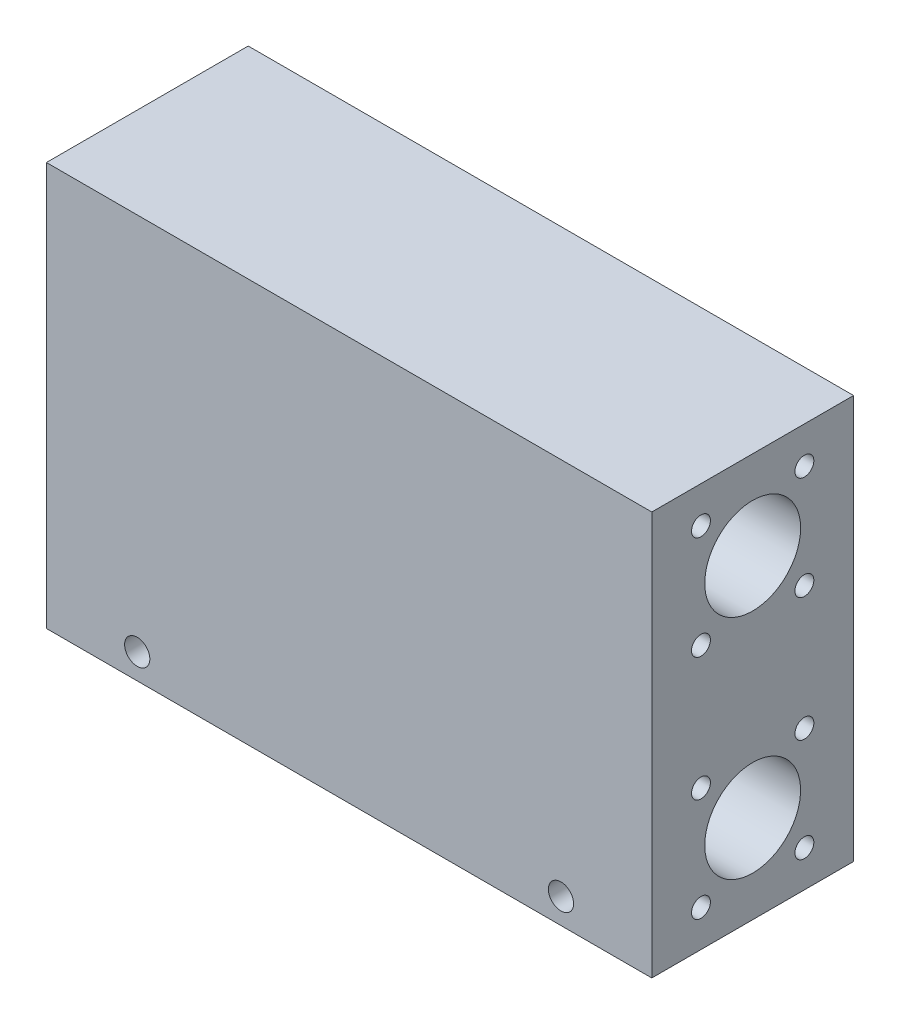
ISO-10303-21;
HEADER;
FILE_DESCRIPTION(('STEP AP214'),'2;1');
FILE_NAME('part.step','',(''),(''),'','','');
FILE_SCHEMA(('AUTOMOTIVE_DESIGN { 1 0 10303 214 1 1 1 1 }'));
ENDSEC;
DATA;
#1=APPLICATION_CONTEXT('core data for automotive mechanical design processes');
#2=APPLICATION_PROTOCOL_DEFINITION('international standard','automotive_design',2000,#1);
#3=PRODUCT_CONTEXT('',#1,'mechanical');
#4=PRODUCT('Part','Part','',(#3));
#5=PRODUCT_RELATED_PRODUCT_CATEGORY('part','',(#4));
#6=PRODUCT_DEFINITION_FORMATION('','',#4);
#7=PRODUCT_DEFINITION_CONTEXT('part definition',#1,'design');
#8=PRODUCT_DEFINITION('design','',#6,#7);
#9=PRODUCT_DEFINITION_SHAPE('','',#8);
#10=(LENGTH_UNIT() NAMED_UNIT(*) SI_UNIT(.MILLI.,.METRE.));
#11=(NAMED_UNIT(*) PLANE_ANGLE_UNIT() SI_UNIT($,.RADIAN.));
#12=(NAMED_UNIT(*) SI_UNIT($,.STERADIAN.) SOLID_ANGLE_UNIT());
#13=UNCERTAINTY_MEASURE_WITH_UNIT(LENGTH_MEASURE(1.E-05),#10,'distance_accuracy_value','');
#14=(GEOMETRIC_REPRESENTATION_CONTEXT(3) GLOBAL_UNCERTAINTY_ASSIGNED_CONTEXT((#13)) GLOBAL_UNIT_ASSIGNED_CONTEXT((#10,
#11,#12)) REPRESENTATION_CONTEXT('',''));
#15=CARTESIAN_POINT('',(0.,0.,0.));
#16=DIRECTION('',(0.,0.,1.));
#17=DIRECTION('',(1.,0.,0.));
#18=AXIS2_PLACEMENT_3D('',#15,#16,#17);
#19=CARTESIAN_POINT('',(0.,0.,40.));
#20=DIRECTION('',(-1.,0.,0.));
#21=DIRECTION('',(0.,0.,1.));
#22=AXIS2_PLACEMENT_3D('',#19,#20,#21);
#23=PLANE('',#22);
#24=CARTESIAN_POINT('',(0.,62.5,20.));
#25=DIRECTION('',(-1.,0.,0.));
#26=DIRECTION('',(0.,0.,1.));
#27=AXIS2_PLACEMENT_3D('',#24,#25,#26);
#28=CIRCLE('',#27,9.5);
#29=CARTESIAN_POINT('',(0.,62.5,29.5));
#30=VERTEX_POINT('',#29);
#31=EDGE_CURVE('E201',#30,#30,#28,.T.);
#32=ORIENTED_EDGE('',*,*,#31,.F.);
#33=EDGE_LOOP('',(#32));
#34=FACE_BOUND('',#33,.T.);
#35=CARTESIAN_POINT('',(0.,17.5,20.));
#36=DIRECTION('',(-1.,0.,0.));
#37=DIRECTION('',(0.,0.,-1.));
#38=AXIS2_PLACEMENT_3D('',#35,#36,#37);
#39=CIRCLE('',#38,9.5);
#40=CARTESIAN_POINT('',(0.,17.5,10.5));
#41=VERTEX_POINT('',#40);
#42=EDGE_CURVE('E204',#41,#41,#39,.T.);
#43=ORIENTED_EDGE('',*,*,#42,.F.);
#44=EDGE_LOOP('',(#43));
#45=FACE_BOUND('',#44,.T.);
#46=CARTESIAN_POINT('',(0.,27.75,9.74999999999998));
#47=DIRECTION('',(-1.,0.,0.));
#48=DIRECTION('',(0.,0.,-1.));
#49=AXIS2_PLACEMENT_3D('',#46,#47,#48);
#50=CIRCLE('',#49,1.85);
#51=CARTESIAN_POINT('',(0.,27.75,7.89999999999998));
#52=VERTEX_POINT('',#51);
#53=EDGE_CURVE('E234',#52,#52,#50,.T.);
#54=ORIENTED_EDGE('',*,*,#53,.F.);
#55=EDGE_LOOP('',(#54));
#56=FACE_BOUND('',#55,.T.);
#57=CARTESIAN_POINT('',(0.,52.25,9.74999999999998));
#58=DIRECTION('',(-1.,0.,0.));
#59=DIRECTION('',(0.,0.,1.));
#60=AXIS2_PLACEMENT_3D('',#57,#58,#59);
#61=CIRCLE('',#60,1.85);
#62=CARTESIAN_POINT('',(0.,52.25,11.6));
#63=VERTEX_POINT('',#62);
#64=EDGE_CURVE('E227',#63,#63,#61,.T.);
#65=ORIENTED_EDGE('',*,*,#64,.F.);
#66=EDGE_LOOP('',(#65));
#67=FACE_BOUND('',#66,.T.);
#68=CARTESIAN_POINT('',(0.,52.25,30.25));
#69=DIRECTION('',(-1.,0.,0.));
#70=DIRECTION('',(0.,0.,-1.));
#71=AXIS2_PLACEMENT_3D('',#68,#69,#70);
#72=CIRCLE('',#71,1.85);
#73=CARTESIAN_POINT('',(0.,52.25,28.4));
#74=VERTEX_POINT('',#73);
#75=EDGE_CURVE('E246',#74,#74,#72,.T.);
#76=ORIENTED_EDGE('',*,*,#75,.F.);
#77=EDGE_LOOP('',(#76));
#78=FACE_BOUND('',#77,.T.);
#79=CARTESIAN_POINT('',(0.,72.75,9.74999999999998));
#80=DIRECTION('',(-1.,0.,0.));
#81=DIRECTION('',(0.,0.,-1.));
#82=AXIS2_PLACEMENT_3D('',#79,#80,#81);
#83=CIRCLE('',#82,1.85);
#84=CARTESIAN_POINT('',(0.,72.75,7.89999999999998));
#85=VERTEX_POINT('',#84);
#86=EDGE_CURVE('E239',#85,#85,#83,.T.);
#87=ORIENTED_EDGE('',*,*,#86,.F.);
#88=EDGE_LOOP('',(#87));
#89=FACE_BOUND('',#88,.T.);
#90=CARTESIAN_POINT('',(0.,27.75,30.25));
#91=DIRECTION('',(-1.,0.,0.));
#92=DIRECTION('',(0.,0.,1.));
#93=AXIS2_PLACEMENT_3D('',#90,#91,#92);
#94=CIRCLE('',#93,1.85);
#95=CARTESIAN_POINT('',(0.,27.75,32.1));
#96=VERTEX_POINT('',#95);
#97=EDGE_CURVE('E209',#96,#96,#94,.T.);
#98=ORIENTED_EDGE('',*,*,#97,.F.);
#99=EDGE_LOOP('',(#98));
#100=FACE_BOUND('',#99,.T.);
#101=CARTESIAN_POINT('',(0.,7.25000000000001,30.25));
#102=DIRECTION('',(-1.,0.,0.));
#103=DIRECTION('',(0.,0.,-1.));
#104=AXIS2_PLACEMENT_3D('',#101,#102,#103);
#105=CIRCLE('',#104,1.85);
#106=CARTESIAN_POINT('',(0.,7.25000000000001,28.4));
#107=VERTEX_POINT('',#106);
#108=EDGE_CURVE('E216',#107,#107,#105,.T.);
#109=ORIENTED_EDGE('',*,*,#108,.F.);
#110=EDGE_LOOP('',(#109));
#111=FACE_BOUND('',#110,.T.);
#112=CARTESIAN_POINT('',(0.,7.25000000000001,9.74999999999998));
#113=DIRECTION('',(-1.,0.,0.));
#114=DIRECTION('',(0.,0.,1.));
#115=AXIS2_PLACEMENT_3D('',#112,#113,#114);
#116=CIRCLE('',#115,1.85);
#117=CARTESIAN_POINT('',(0.,7.25000000000001,11.6));
#118=VERTEX_POINT('',#117);
#119=EDGE_CURVE('E222',#118,#118,#116,.T.);
#120=ORIENTED_EDGE('',*,*,#119,.F.);
#121=EDGE_LOOP('',(#120));
#122=FACE_BOUND('',#121,.T.);
#123=CARTESIAN_POINT('',(0.,72.75,30.25));
#124=DIRECTION('',(-1.,0.,0.));
#125=DIRECTION('',(0.,0.,1.));
#126=AXIS2_PLACEMENT_3D('',#123,#124,#125);
#127=CIRCLE('',#126,1.85);
#128=CARTESIAN_POINT('',(0.,72.75,32.1));
#129=VERTEX_POINT('',#128);
#130=EDGE_CURVE('E242',#129,#129,#127,.T.);
#131=ORIENTED_EDGE('',*,*,#130,.F.);
#132=EDGE_LOOP('',(#131));
#133=FACE_BOUND('',#132,.T.);
#134=DIRECTION('',(0.,1.,0.));
#135=VECTOR('',#134,1.);
#136=CARTESIAN_POINT('',(0.,0.,0.));
#137=LINE('',#136,#135);
#138=CARTESIAN_POINT('',(0.,0.,0.));
#139=VERTEX_POINT('',#138);
#140=CARTESIAN_POINT('',(0.,80.,0.));
#141=VERTEX_POINT('',#140);
#142=EDGE_CURVE('E109',#139,#141,#137,.T.);
#143=ORIENTED_EDGE('',*,*,#142,.F.);
#144=DIRECTION('',(0.,0.,-1.));
#145=VECTOR('',#144,1.);
#146=CARTESIAN_POINT('',(0.,0.,40.));
#147=LINE('',#146,#145);
#148=CARTESIAN_POINT('',(0.,0.,40.));
#149=VERTEX_POINT('',#148);
#150=EDGE_CURVE('E11',#149,#139,#147,.T.);
#151=ORIENTED_EDGE('',*,*,#150,.F.);
#152=DIRECTION('',(0.,1.,0.));
#153=VECTOR('',#152,1.);
#154=CARTESIAN_POINT('',(0.,0.,40.));
#155=LINE('',#154,#153);
#156=CARTESIAN_POINT('',(0.,80.,40.));
#157=VERTEX_POINT('',#156);
#158=EDGE_CURVE('E103',#149,#157,#155,.T.);
#159=ORIENTED_EDGE('',*,*,#158,.T.);
#160=DIRECTION('',(0.,0.,-1.));
#161=VECTOR('',#160,1.);
#162=CARTESIAN_POINT('',(0.,80.,40.));
#163=LINE('',#162,#161);
#164=EDGE_CURVE('E82',#157,#141,#163,.T.);
#165=ORIENTED_EDGE('',*,*,#164,.T.);
#166=EDGE_LOOP('',(#143,#151,#159,#165));
#167=FACE_BOUND('',#166,.T.);
#168=ADVANCED_FACE('F41',(#34,#45,#56,#67,#78,#89,#100,#111,#122,#133,#167),#23,.T.);
#169=CARTESIAN_POINT('',(0.,0.,40.));
#170=DIRECTION('',(0.,1.,0.));
#171=DIRECTION('',(0.,0.,1.));
#172=AXIS2_PLACEMENT_3D('',#169,#170,#171);
#173=PLANE('',#172);
#174=DIRECTION('',(1.,0.,0.));
#175=VECTOR('',#174,1.);
#176=CARTESIAN_POINT('',(0.,0.,0.));
#177=LINE('',#176,#175);
#178=CARTESIAN_POINT('',(120.,0.,0.));
#179=VERTEX_POINT('',#178);
#180=EDGE_CURVE('E74',#139,#179,#177,.T.);
#181=ORIENTED_EDGE('',*,*,#180,.T.);
#182=DIRECTION('',(0.,0.,-1.));
#183=VECTOR('',#182,1.);
#184=CARTESIAN_POINT('',(120.,0.,40.));
#185=LINE('',#184,#183);
#186=CARTESIAN_POINT('',(120.,0.,40.));
#187=VERTEX_POINT('',#186);
#188=EDGE_CURVE('E50',#187,#179,#185,.T.);
#189=ORIENTED_EDGE('',*,*,#188,.F.);
#190=DIRECTION('',(1.,0.,0.));
#191=VECTOR('',#190,1.);
#192=CARTESIAN_POINT('',(0.,0.,40.));
#193=LINE('',#192,#191);
#194=EDGE_CURVE('E92',#149,#187,#193,.T.);
#195=ORIENTED_EDGE('',*,*,#194,.F.);
#196=ORIENTED_EDGE('',*,*,#150,.T.);
#197=EDGE_LOOP('',(#181,#189,#195,#196));
#198=FACE_BOUND('',#197,.T.);
#199=ADVANCED_FACE('F258',(#198),#173,.F.);
#200=CARTESIAN_POINT('',(120.,0.,40.));
#201=DIRECTION('',(-1.,0.,0.));
#202=DIRECTION('',(0.,0.,1.));
#203=AXIS2_PLACEMENT_3D('',#200,#201,#202);
#204=PLANE('',#203);
#205=CARTESIAN_POINT('',(120.,62.5,20.));
#206=DIRECTION('',(1.,0.,0.));
#207=DIRECTION('',(0.,0.,-1.));
#208=AXIS2_PLACEMENT_3D('',#205,#206,#207);
#209=CIRCLE('',#208,9.5);
#210=CARTESIAN_POINT('',(120.,62.5,10.5));
#211=VERTEX_POINT('',#210);
#212=EDGE_CURVE('E141',#211,#211,#209,.T.);
#213=ORIENTED_EDGE('',*,*,#212,.F.);
#214=EDGE_LOOP('',(#213));
#215=FACE_BOUND('',#214,.T.);
#216=CARTESIAN_POINT('',(120.,17.5,20.));
#217=DIRECTION('',(1.,0.,0.));
#218=DIRECTION('',(0.,0.,1.));
#219=AXIS2_PLACEMENT_3D('',#216,#217,#218);
#220=CIRCLE('',#219,9.5);
#221=CARTESIAN_POINT('',(120.,17.5,29.5));
#222=VERTEX_POINT('',#221);
#223=EDGE_CURVE('E144',#222,#222,#220,.T.);
#224=ORIENTED_EDGE('',*,*,#223,.F.);
#225=EDGE_LOOP('',(#224));
#226=FACE_BOUND('',#225,.T.);
#227=CARTESIAN_POINT('',(120.,27.75,30.25));
#228=DIRECTION('',(1.,0.,0.));
#229=DIRECTION('',(0.,0.,1.));
#230=AXIS2_PLACEMENT_3D('',#227,#228,#229);
#231=CIRCLE('',#230,1.875);
#232=CARTESIAN_POINT('',(120.,27.75,32.125));
#233=VERTEX_POINT('',#232);
#234=EDGE_CURVE('E174',#233,#233,#231,.T.);
#235=ORIENTED_EDGE('',*,*,#234,.F.);
#236=EDGE_LOOP('',(#235));
#237=FACE_BOUND('',#236,.T.);
#238=CARTESIAN_POINT('',(120.,52.25,30.25));
#239=DIRECTION('',(1.,0.,0.));
#240=DIRECTION('',(0.,0.,-1.));
#241=AXIS2_PLACEMENT_3D('',#238,#239,#240);
#242=CIRCLE('',#241,1.875);
#243=CARTESIAN_POINT('',(120.,52.25,28.375));
#244=VERTEX_POINT('',#243);
#245=EDGE_CURVE('E167',#244,#244,#242,.T.);
#246=ORIENTED_EDGE('',*,*,#245,.F.);
#247=EDGE_LOOP('',(#246));
#248=FACE_BOUND('',#247,.T.);
#249=CARTESIAN_POINT('',(120.,52.25,9.75));
#250=DIRECTION('',(1.,0.,0.));
#251=DIRECTION('',(0.,0.,1.));
#252=AXIS2_PLACEMENT_3D('',#249,#250,#251);
#253=CIRCLE('',#252,1.875);
#254=CARTESIAN_POINT('',(120.,52.25,11.625));
#255=VERTEX_POINT('',#254);
#256=EDGE_CURVE('E186',#255,#255,#253,.T.);
#257=ORIENTED_EDGE('',*,*,#256,.F.);
#258=EDGE_LOOP('',(#257));
#259=FACE_BOUND('',#258,.T.);
#260=CARTESIAN_POINT('',(120.,72.75,30.25));
#261=DIRECTION('',(1.,0.,0.));
#262=DIRECTION('',(0.,0.,1.));
#263=AXIS2_PLACEMENT_3D('',#260,#261,#262);
#264=CIRCLE('',#263,1.875);
#265=CARTESIAN_POINT('',(120.,72.75,32.125));
#266=VERTEX_POINT('',#265);
#267=EDGE_CURVE('E179',#266,#266,#264,.T.);
#268=ORIENTED_EDGE('',*,*,#267,.F.);
#269=EDGE_LOOP('',(#268));
#270=FACE_BOUND('',#269,.T.);
#271=CARTESIAN_POINT('',(120.,27.75,9.75));
#272=DIRECTION('',(1.,0.,0.));
#273=DIRECTION('',(0.,0.,-1.));
#274=AXIS2_PLACEMENT_3D('',#271,#272,#273);
#275=CIRCLE('',#274,1.875);
#276=CARTESIAN_POINT('',(120.,27.75,7.875));
#277=VERTEX_POINT('',#276);
#278=EDGE_CURVE('E149',#277,#277,#275,.T.);
#279=ORIENTED_EDGE('',*,*,#278,.F.);
#280=EDGE_LOOP('',(#279));
#281=FACE_BOUND('',#280,.T.);
#282=CARTESIAN_POINT('',(120.,7.25000000000001,9.75));
#283=DIRECTION('',(1.,0.,0.));
#284=DIRECTION('',(0.,0.,1.));
#285=AXIS2_PLACEMENT_3D('',#282,#283,#284);
#286=CIRCLE('',#285,1.875);
#287=CARTESIAN_POINT('',(120.,7.25000000000001,11.625));
#288=VERTEX_POINT('',#287);
#289=EDGE_CURVE('E156',#288,#288,#286,.T.);
#290=ORIENTED_EDGE('',*,*,#289,.F.);
#291=EDGE_LOOP('',(#290));
#292=FACE_BOUND('',#291,.T.);
#293=CARTESIAN_POINT('',(120.,7.25000000000001,30.25));
#294=DIRECTION('',(1.,0.,0.));
#295=DIRECTION('',(0.,0.,-1.));
#296=AXIS2_PLACEMENT_3D('',#293,#294,#295);
#297=CIRCLE('',#296,1.875);
#298=CARTESIAN_POINT('',(120.,7.25000000000001,28.375));
#299=VERTEX_POINT('',#298);
#300=EDGE_CURVE('E162',#299,#299,#297,.T.);
#301=ORIENTED_EDGE('',*,*,#300,.F.);
#302=EDGE_LOOP('',(#301));
#303=FACE_BOUND('',#302,.T.);
#304=CARTESIAN_POINT('',(120.,72.75,9.75));
#305=DIRECTION('',(1.,0.,0.));
#306=DIRECTION('',(0.,0.,-1.));
#307=AXIS2_PLACEMENT_3D('',#304,#305,#306);
#308=CIRCLE('',#307,1.875);
#309=CARTESIAN_POINT('',(120.,72.75,7.875));
#310=VERTEX_POINT('',#309);
#311=EDGE_CURVE('E182',#310,#310,#308,.T.);
#312=ORIENTED_EDGE('',*,*,#311,.F.);
#313=EDGE_LOOP('',(#312));
#314=FACE_BOUND('',#313,.T.);
#315=DIRECTION('',(0.,1.,0.));
#316=VECTOR('',#315,1.);
#317=CARTESIAN_POINT('',(120.,0.,0.));
#318=LINE('',#317,#316);
#319=CARTESIAN_POINT('',(120.,80.,0.));
#320=VERTEX_POINT('',#319);
#321=EDGE_CURVE('E99',#179,#320,#318,.T.);
#322=ORIENTED_EDGE('',*,*,#321,.T.);
#323=DIRECTION('',(0.,0.,-1.));
#324=VECTOR('',#323,1.);
#325=CARTESIAN_POINT('',(120.,80.,40.));
#326=LINE('',#325,#324);
#327=CARTESIAN_POINT('',(120.,80.,40.));
#328=VERTEX_POINT('',#327);
#329=EDGE_CURVE('E96',#328,#320,#326,.T.);
#330=ORIENTED_EDGE('',*,*,#329,.F.);
#331=DIRECTION('',(0.,1.,0.));
#332=VECTOR('',#331,1.);
#333=CARTESIAN_POINT('',(120.,0.,40.));
#334=LINE('',#333,#332);
#335=EDGE_CURVE('E87',#187,#328,#334,.T.);
#336=ORIENTED_EDGE('',*,*,#335,.F.);
#337=ORIENTED_EDGE('',*,*,#188,.T.);
#338=EDGE_LOOP('',(#322,#330,#336,#337));
#339=FACE_BOUND('',#338,.T.);
#340=ADVANCED_FACE('F97',(#215,#226,#237,#248,#259,#270,#281,#292,#303,#314,#339),#204,.F.);
#341=CARTESIAN_POINT('',(0.,80.,40.));
#342=DIRECTION('',(0.,1.,0.));
#343=DIRECTION('',(0.,0.,1.));
#344=AXIS2_PLACEMENT_3D('',#341,#342,#343);
#345=PLANE('',#344);
#346=DIRECTION('',(1.,0.,0.));
#347=VECTOR('',#346,1.);
#348=CARTESIAN_POINT('',(0.,80.,0.));
#349=LINE('',#348,#347);
#350=EDGE_CURVE('E112',#141,#320,#349,.T.);
#351=ORIENTED_EDGE('',*,*,#350,.F.);
#352=ORIENTED_EDGE('',*,*,#164,.F.);
#353=DIRECTION('',(1.,0.,0.));
#354=VECTOR('',#353,1.);
#355=CARTESIAN_POINT('',(0.,80.,40.));
#356=LINE('',#355,#354);
#357=EDGE_CURVE('E91',#157,#328,#356,.T.);
#358=ORIENTED_EDGE('',*,*,#357,.T.);
#359=ORIENTED_EDGE('',*,*,#329,.T.);
#360=EDGE_LOOP('',(#351,#352,#358,#359));
#361=FACE_BOUND('',#360,.T.);
#362=ADVANCED_FACE('F102',(#361),#345,.T.);
#363=CARTESIAN_POINT('',(0.,0.,40.));
#364=DIRECTION('',(0.,0.,-1.));
#365=DIRECTION('',(-1.,0.,0.));
#366=AXIS2_PLACEMENT_3D('',#363,#364,#365);
#367=PLANE('',#366);
#368=CARTESIAN_POINT('',(102.,5.,40.));
#369=DIRECTION('',(0.,0.,-1.));
#370=DIRECTION('',(-1.,0.,0.));
#371=AXIS2_PLACEMENT_3D('',#368,#369,#370);
#372=CIRCLE('',#371,2.49999999999999);
#373=CARTESIAN_POINT('',(99.5,5.,40.));
#374=VERTEX_POINT('',#373);
#375=EDGE_CURVE('E131',#374,#374,#372,.T.);
#376=ORIENTED_EDGE('',*,*,#375,.T.);
#377=EDGE_LOOP('',(#376));
#378=FACE_BOUND('',#377,.T.);
#379=CARTESIAN_POINT('',(18.,5.,40.));
#380=DIRECTION('',(0.,0.,-1.));
#381=DIRECTION('',(-1.,0.,0.));
#382=AXIS2_PLACEMENT_3D('',#379,#380,#381);
#383=CIRCLE('',#382,2.5);
#384=CARTESIAN_POINT('',(15.5,5.,40.));
#385=VERTEX_POINT('',#384);
#386=EDGE_CURVE('E134',#385,#385,#383,.T.);
#387=ORIENTED_EDGE('',*,*,#386,.T.);
#388=EDGE_LOOP('',(#387));
#389=FACE_BOUND('',#388,.T.);
#390=ORIENTED_EDGE('',*,*,#158,.F.);
#391=ORIENTED_EDGE('',*,*,#194,.T.);
#392=ORIENTED_EDGE('',*,*,#335,.T.);
#393=ORIENTED_EDGE('',*,*,#357,.F.);
#394=EDGE_LOOP('',(#390,#391,#392,#393));
#395=FACE_BOUND('',#394,.T.);
#396=ADVANCED_FACE('F90',(#378,#389,#395),#367,.F.);
#397=CARTESIAN_POINT('',(0.,0.,0.));
#398=DIRECTION('',(0.,0.,-1.));
#399=DIRECTION('',(-1.,0.,0.));
#400=AXIS2_PLACEMENT_3D('',#397,#398,#399);
#401=PLANE('',#400);
#402=CARTESIAN_POINT('',(102.,5.,0.));
#403=DIRECTION('',(0.,0.,-1.));
#404=DIRECTION('',(-1.,0.,0.));
#405=AXIS2_PLACEMENT_3D('',#402,#403,#404);
#406=CIRCLE('',#405,2.49999999999999);
#407=CARTESIAN_POINT('',(99.5,5.,0.));
#408=VERTEX_POINT('',#407);
#409=EDGE_CURVE('E936',#408,#408,#406,.T.);
#410=ORIENTED_EDGE('',*,*,#409,.F.);
#411=EDGE_LOOP('',(#410));
#412=FACE_BOUND('',#411,.T.);
#413=CARTESIAN_POINT('',(18.,5.,0.));
#414=DIRECTION('',(0.,0.,-1.));
#415=DIRECTION('',(-1.,0.,0.));
#416=AXIS2_PLACEMENT_3D('',#413,#414,#415);
#417=CIRCLE('',#416,2.5);
#418=CARTESIAN_POINT('',(15.5,5.,0.));
#419=VERTEX_POINT('',#418);
#420=EDGE_CURVE('E937',#419,#419,#417,.T.);
#421=ORIENTED_EDGE('',*,*,#420,.F.);
#422=EDGE_LOOP('',(#421));
#423=FACE_BOUND('',#422,.T.);
#424=ORIENTED_EDGE('',*,*,#142,.T.);
#425=ORIENTED_EDGE('',*,*,#350,.T.);
#426=ORIENTED_EDGE('',*,*,#321,.F.);
#427=ORIENTED_EDGE('',*,*,#180,.F.);
#428=EDGE_LOOP('',(#424,#425,#426,#427));
#429=FACE_BOUND('',#428,.T.);
#430=ADVANCED_FACE('F261',(#412,#423,#429),#401,.T.);
#431=CARTESIAN_POINT('',(14.,72.75,30.25));
#432=DIRECTION('',(-1.,0.,0.));
#433=DIRECTION('',(0.,0.,1.));
#434=AXIS2_PLACEMENT_3D('',#431,#432,#433);
#435=CYLINDRICAL_SURFACE('',#434,1.85);
#436=CARTESIAN_POINT('',(14.,72.75,30.25));
#437=DIRECTION('',(-1.,0.,0.));
#438=DIRECTION('',(0.,0.,1.));
#439=AXIS2_PLACEMENT_3D('',#436,#437,#438);
#440=CIRCLE('',#439,1.85);
#441=CARTESIAN_POINT('',(14.,72.75,32.1));
#442=VERTEX_POINT('',#441);
#443=EDGE_CURVE('E113',#442,#442,#440,.T.);
#444=ORIENTED_EDGE('',*,*,#443,.F.);
#445=EDGE_LOOP('',(#444));
#446=FACE_BOUND('',#445,.T.);
#447=ORIENTED_EDGE('',*,*,#130,.T.);
#448=EDGE_LOOP('',(#447));
#449=FACE_BOUND('',#448,.T.);
#450=ADVANCED_FACE('F255',(#446,#449),#435,.F.);
#451=CARTESIAN_POINT('',(14.,72.75,30.25));
#452=DIRECTION('',(-1.,0.,0.));
#453=DIRECTION('',(0.,0.,1.));
#454=AXIS2_PLACEMENT_3D('',#451,#452,#453);
#455=PLANE('',#454);
#456=ORIENTED_EDGE('',*,*,#443,.T.);
#457=EDGE_LOOP('',(#456));
#458=FACE_BOUND('',#457,.T.);
#459=ADVANCED_FACE('F269',(#458),#455,.T.);
#460=CARTESIAN_POINT('',(14.,7.25000000000001,9.74999999999998));
#461=DIRECTION('',(-1.,0.,0.));
#462=DIRECTION('',(0.,0.,1.));
#463=AXIS2_PLACEMENT_3D('',#460,#461,#462);
#464=CYLINDRICAL_SURFACE('',#463,1.85);
#465=CARTESIAN_POINT('',(14.,7.25000000000001,9.74999999999998));
#466=DIRECTION('',(-1.,0.,0.));
#467=DIRECTION('',(0.,0.,1.));
#468=AXIS2_PLACEMENT_3D('',#465,#466,#467);
#469=CIRCLE('',#468,1.85);
#470=CARTESIAN_POINT('',(14.,7.25000000000001,11.6));
#471=VERTEX_POINT('',#470);
#472=EDGE_CURVE('E200',#471,#471,#469,.T.);
#473=ORIENTED_EDGE('',*,*,#472,.F.);
#474=EDGE_LOOP('',(#473));
#475=FACE_BOUND('',#474,.T.);
#476=ORIENTED_EDGE('',*,*,#119,.T.);
#477=EDGE_LOOP('',(#476));
#478=FACE_BOUND('',#477,.T.);
#479=ADVANCED_FACE('F713',(#475,#478),#464,.F.);
#480=CARTESIAN_POINT('',(14.,7.25000000000001,9.74999999999998));
#481=DIRECTION('',(-1.,0.,0.));
#482=DIRECTION('',(0.,0.,1.));
#483=AXIS2_PLACEMENT_3D('',#480,#481,#482);
#484=PLANE('',#483);
#485=ORIENTED_EDGE('',*,*,#472,.T.);
#486=EDGE_LOOP('',(#485));
#487=FACE_BOUND('',#486,.T.);
#488=ADVANCED_FACE('F703',(#487),#484,.T.);
#489=CARTESIAN_POINT('',(14.,7.25000000000001,30.25));
#490=DIRECTION('',(-1.,0.,0.));
#491=DIRECTION('',(0.,0.,1.));
#492=AXIS2_PLACEMENT_3D('',#489,#490,#491);
#493=CYLINDRICAL_SURFACE('',#492,1.85);
#494=CARTESIAN_POINT('',(14.,7.25000000000001,30.25));
#495=DIRECTION('',(-1.,0.,0.));
#496=DIRECTION('',(0.,0.,-1.));
#497=AXIS2_PLACEMENT_3D('',#494,#495,#496);
#498=CIRCLE('',#497,1.85);
#499=CARTESIAN_POINT('',(14.,7.25000000000001,28.4));
#500=VERTEX_POINT('',#499);
#501=EDGE_CURVE('E219',#500,#500,#498,.T.);
#502=ORIENTED_EDGE('',*,*,#501,.F.);
#503=EDGE_LOOP('',(#502));
#504=FACE_BOUND('',#503,.T.);
#505=ORIENTED_EDGE('',*,*,#108,.T.);
#506=EDGE_LOOP('',(#505));
#507=FACE_BOUND('',#506,.T.);
#508=ADVANCED_FACE('F693',(#504,#507),#493,.F.);
#509=CARTESIAN_POINT('',(14.,7.25000000000001,30.25));
#510=DIRECTION('',(1.,0.,0.));
#511=DIRECTION('',(0.,0.,-1.));
#512=AXIS2_PLACEMENT_3D('',#509,#510,#511);
#513=PLANE('',#512);
#514=ORIENTED_EDGE('',*,*,#501,.T.);
#515=EDGE_LOOP('',(#514));
#516=FACE_BOUND('',#515,.T.);
#517=ADVANCED_FACE('F683',(#516),#513,.F.);
#518=CARTESIAN_POINT('',(14.,27.75,30.25));
#519=DIRECTION('',(-1.,0.,0.));
#520=DIRECTION('',(0.,0.,1.));
#521=AXIS2_PLACEMENT_3D('',#518,#519,#520);
#522=CYLINDRICAL_SURFACE('',#521,1.85);
#523=CARTESIAN_POINT('',(14.,27.75,30.25));
#524=DIRECTION('',(-1.,0.,0.));
#525=DIRECTION('',(0.,0.,1.));
#526=AXIS2_PLACEMENT_3D('',#523,#524,#525);
#527=CIRCLE('',#526,1.85);
#528=CARTESIAN_POINT('',(14.,27.75,32.1));
#529=VERTEX_POINT('',#528);
#530=EDGE_CURVE('E213',#529,#529,#527,.T.);
#531=ORIENTED_EDGE('',*,*,#530,.F.);
#532=EDGE_LOOP('',(#531));
#533=FACE_BOUND('',#532,.T.);
#534=ORIENTED_EDGE('',*,*,#97,.T.);
#535=EDGE_LOOP('',(#534));
#536=FACE_BOUND('',#535,.T.);
#537=ADVANCED_FACE('F673',(#533,#536),#522,.F.);
#538=CARTESIAN_POINT('',(14.,27.75,30.25));
#539=DIRECTION('',(-1.,0.,0.));
#540=DIRECTION('',(0.,0.,1.));
#541=AXIS2_PLACEMENT_3D('',#538,#539,#540);
#542=PLANE('',#541);
#543=ORIENTED_EDGE('',*,*,#530,.T.);
#544=EDGE_LOOP('',(#543));
#545=FACE_BOUND('',#544,.T.);
#546=ADVANCED_FACE('F663',(#545),#542,.T.);
#547=CARTESIAN_POINT('',(14.,72.75,9.74999999999998));
#548=DIRECTION('',(-1.,0.,0.));
#549=DIRECTION('',(0.,0.,1.));
#550=AXIS2_PLACEMENT_3D('',#547,#548,#549);
#551=CYLINDRICAL_SURFACE('',#550,1.85);
#552=CARTESIAN_POINT('',(14.,72.75,9.74999999999998));
#553=DIRECTION('',(-1.,0.,0.));
#554=DIRECTION('',(0.,0.,-1.));
#555=AXIS2_PLACEMENT_3D('',#552,#553,#554);
#556=CIRCLE('',#555,1.85);
#557=CARTESIAN_POINT('',(14.,72.75,7.89999999999998));
#558=VERTEX_POINT('',#557);
#559=EDGE_CURVE('E243',#558,#558,#556,.T.);
#560=ORIENTED_EDGE('',*,*,#559,.F.);
#561=EDGE_LOOP('',(#560));
#562=FACE_BOUND('',#561,.T.);
#563=ORIENTED_EDGE('',*,*,#86,.T.);
#564=EDGE_LOOP('',(#563));
#565=FACE_BOUND('',#564,.T.);
#566=ADVANCED_FACE('F653',(#562,#565),#551,.F.);
#567=CARTESIAN_POINT('',(14.,72.75,9.74999999999998));
#568=DIRECTION('',(1.,0.,0.));
#569=DIRECTION('',(0.,0.,-1.));
#570=AXIS2_PLACEMENT_3D('',#567,#568,#569);
#571=PLANE('',#570);
#572=ORIENTED_EDGE('',*,*,#559,.T.);
#573=EDGE_LOOP('',(#572));
#574=FACE_BOUND('',#573,.T.);
#575=ADVANCED_FACE('F643',(#574),#571,.F.);
#576=CARTESIAN_POINT('',(14.,52.25,30.25));
#577=DIRECTION('',(-1.,0.,0.));
#578=DIRECTION('',(0.,0.,1.));
#579=AXIS2_PLACEMENT_3D('',#576,#577,#578);
#580=CYLINDRICAL_SURFACE('',#579,1.85);
#581=CARTESIAN_POINT('',(14.,52.25,30.25));
#582=DIRECTION('',(-1.,0.,0.));
#583=DIRECTION('',(0.,0.,-1.));
#584=AXIS2_PLACEMENT_3D('',#581,#582,#583);
#585=CIRCLE('',#584,1.85);
#586=CARTESIAN_POINT('',(14.,52.25,28.4));
#587=VERTEX_POINT('',#586);
#588=EDGE_CURVE('E230',#587,#587,#585,.T.);
#589=ORIENTED_EDGE('',*,*,#588,.F.);
#590=EDGE_LOOP('',(#589));
#591=FACE_BOUND('',#590,.T.);
#592=ORIENTED_EDGE('',*,*,#75,.T.);
#593=EDGE_LOOP('',(#592));
#594=FACE_BOUND('',#593,.T.);
#595=ADVANCED_FACE('F633',(#591,#594),#580,.F.);
#596=CARTESIAN_POINT('',(14.,52.25,30.25));
#597=DIRECTION('',(1.,0.,0.));
#598=DIRECTION('',(0.,0.,-1.));
#599=AXIS2_PLACEMENT_3D('',#596,#597,#598);
#600=PLANE('',#599);
#601=ORIENTED_EDGE('',*,*,#588,.T.);
#602=EDGE_LOOP('',(#601));
#603=FACE_BOUND('',#602,.T.);
#604=ADVANCED_FACE('F623',(#603),#600,.F.);
#605=CARTESIAN_POINT('',(14.,52.25,9.74999999999998));
#606=DIRECTION('',(-1.,0.,0.));
#607=DIRECTION('',(0.,0.,1.));
#608=AXIS2_PLACEMENT_3D('',#605,#606,#607);
#609=CYLINDRICAL_SURFACE('',#608,1.85);
#610=CARTESIAN_POINT('',(14.,52.25,9.74999999999998));
#611=DIRECTION('',(-1.,0.,0.));
#612=DIRECTION('',(0.,0.,1.));
#613=AXIS2_PLACEMENT_3D('',#610,#611,#612);
#614=CIRCLE('',#613,1.85);
#615=CARTESIAN_POINT('',(14.,52.25,11.6));
#616=VERTEX_POINT('',#615);
#617=EDGE_CURVE('E231',#616,#616,#614,.T.);
#618=ORIENTED_EDGE('',*,*,#617,.F.);
#619=EDGE_LOOP('',(#618));
#620=FACE_BOUND('',#619,.T.);
#621=ORIENTED_EDGE('',*,*,#64,.T.);
#622=EDGE_LOOP('',(#621));
#623=FACE_BOUND('',#622,.T.);
#624=ADVANCED_FACE('F613',(#620,#623),#609,.F.);
#625=CARTESIAN_POINT('',(14.,52.25,9.74999999999998));
#626=DIRECTION('',(-1.,0.,0.));
#627=DIRECTION('',(0.,0.,1.));
#628=AXIS2_PLACEMENT_3D('',#625,#626,#627);
#629=PLANE('',#628);
#630=ORIENTED_EDGE('',*,*,#617,.T.);
#631=EDGE_LOOP('',(#630));
#632=FACE_BOUND('',#631,.T.);
#633=ADVANCED_FACE('F603',(#632),#629,.T.);
#634=CARTESIAN_POINT('',(14.,27.75,9.74999999999998));
#635=DIRECTION('',(-1.,0.,0.));
#636=DIRECTION('',(0.,0.,1.));
#637=AXIS2_PLACEMENT_3D('',#634,#635,#636);
#638=CYLINDRICAL_SURFACE('',#637,1.85);
#639=CARTESIAN_POINT('',(14.,27.75,9.74999999999998));
#640=DIRECTION('',(-1.,0.,0.));
#641=DIRECTION('',(0.,0.,-1.));
#642=AXIS2_PLACEMENT_3D('',#639,#640,#641);
#643=CIRCLE('',#642,1.85);
#644=CARTESIAN_POINT('',(14.,27.75,7.89999999999998));
#645=VERTEX_POINT('',#644);
#646=EDGE_CURVE('E212',#645,#645,#643,.T.);
#647=ORIENTED_EDGE('',*,*,#646,.F.);
#648=EDGE_LOOP('',(#647));
#649=FACE_BOUND('',#648,.T.);
#650=ORIENTED_EDGE('',*,*,#53,.T.);
#651=EDGE_LOOP('',(#650));
#652=FACE_BOUND('',#651,.T.);
#653=ADVANCED_FACE('F593',(#649,#652),#638,.F.);
#654=CARTESIAN_POINT('',(14.,27.75,9.74999999999998));
#655=DIRECTION('',(1.,0.,0.));
#656=DIRECTION('',(0.,0.,-1.));
#657=AXIS2_PLACEMENT_3D('',#654,#655,#656);
#658=PLANE('',#657);
#659=ORIENTED_EDGE('',*,*,#646,.T.);
#660=EDGE_LOOP('',(#659));
#661=FACE_BOUND('',#660,.T.);
#662=ADVANCED_FACE('F583',(#661),#658,.F.);
#663=CARTESIAN_POINT('',(55.,17.5,20.));
#664=DIRECTION('',(-1.,0.,0.));
#665=DIRECTION('',(0.,0.,1.));
#666=AXIS2_PLACEMENT_3D('',#663,#664,#665);
#667=CYLINDRICAL_SURFACE('',#666,9.5);
#668=CARTESIAN_POINT('',(55.,17.5,20.));
#669=DIRECTION('',(-1.,0.,0.));
#670=DIRECTION('',(0.,0.,-1.));
#671=AXIS2_PLACEMENT_3D('',#668,#669,#670);
#672=CIRCLE('',#671,9.5);
#673=CARTESIAN_POINT('',(55.,17.5,10.5));
#674=VERTEX_POINT('',#673);
#675=EDGE_CURVE('E194',#674,#674,#672,.T.);
#676=ORIENTED_EDGE('',*,*,#675,.F.);
#677=EDGE_LOOP('',(#676));
#678=FACE_BOUND('',#677,.T.);
#679=ORIENTED_EDGE('',*,*,#42,.T.);
#680=EDGE_LOOP('',(#679));
#681=FACE_BOUND('',#680,.T.);
#682=ADVANCED_FACE('F573',(#678,#681),#667,.F.);
#683=CARTESIAN_POINT('',(55.,17.5,20.));
#684=DIRECTION('',(1.,0.,0.));
#685=DIRECTION('',(0.,0.,-1.));
#686=AXIS2_PLACEMENT_3D('',#683,#684,#685);
#687=PLANE('',#686);
#688=CARTESIAN_POINT('',(55.,17.5,20.));
#689=DIRECTION('',(1.,0.,0.));
#690=DIRECTION('',(0.,0.,-1.));
#691=AXIS2_PLACEMENT_3D('',#688,#689,#690);
#692=CIRCLE('',#691,6.);
#693=CARTESIAN_POINT('',(55.,17.5,14.));
#694=VERTEX_POINT('',#693);
#695=EDGE_CURVE('E44',#694,#694,#692,.T.);
#696=ORIENTED_EDGE('',*,*,#695,.T.);
#697=EDGE_LOOP('',(#696));
#698=FACE_BOUND('',#697,.T.);
#699=ORIENTED_EDGE('',*,*,#675,.T.);
#700=EDGE_LOOP('',(#699));
#701=FACE_BOUND('',#700,.T.);
#702=ADVANCED_FACE('F563',(#698,#701),#687,.F.);
#703=CARTESIAN_POINT('',(55.,62.5,20.));
#704=DIRECTION('',(-1.,0.,0.));
#705=DIRECTION('',(0.,0.,1.));
#706=AXIS2_PLACEMENT_3D('',#703,#704,#705);
#707=CYLINDRICAL_SURFACE('',#706,9.5);
#708=CARTESIAN_POINT('',(55.,62.5,20.));
#709=DIRECTION('',(-1.,0.,0.));
#710=DIRECTION('',(0.,0.,1.));
#711=AXIS2_PLACEMENT_3D('',#708,#709,#710);
#712=CIRCLE('',#711,9.5);
#713=CARTESIAN_POINT('',(55.,62.5,29.5));
#714=VERTEX_POINT('',#713);
#715=EDGE_CURVE('E197',#714,#714,#712,.T.);
#716=ORIENTED_EDGE('',*,*,#715,.F.);
#717=EDGE_LOOP('',(#716));
#718=FACE_BOUND('',#717,.T.);
#719=ORIENTED_EDGE('',*,*,#31,.T.);
#720=EDGE_LOOP('',(#719));
#721=FACE_BOUND('',#720,.T.);
#722=ADVANCED_FACE('F553',(#718,#721),#707,.F.);
#723=CARTESIAN_POINT('',(55.,62.5,20.));
#724=DIRECTION('',(-1.,0.,0.));
#725=DIRECTION('',(0.,0.,1.));
#726=AXIS2_PLACEMENT_3D('',#723,#724,#725);
#727=PLANE('',#726);
#728=CARTESIAN_POINT('',(55.,62.5,20.));
#729=DIRECTION('',(-1.,0.,0.));
#730=DIRECTION('',(0.,0.,1.));
#731=AXIS2_PLACEMENT_3D('',#728,#729,#730);
#732=CIRCLE('',#731,6.);
#733=CARTESIAN_POINT('',(55.,62.5,26.));
#734=VERTEX_POINT('',#733);
#735=EDGE_CURVE('E118',#734,#734,#732,.T.);
#736=ORIENTED_EDGE('',*,*,#735,.F.);
#737=EDGE_LOOP('',(#736));
#738=FACE_BOUND('',#737,.T.);
#739=ORIENTED_EDGE('',*,*,#715,.T.);
#740=EDGE_LOOP('',(#739));
#741=FACE_BOUND('',#740,.T.);
#742=ADVANCED_FACE('F543',(#738,#741),#727,.T.);
#743=CARTESIAN_POINT('',(106.,72.75,9.75));
#744=DIRECTION('',(1.,0.,0.));
#745=DIRECTION('',(0.,0.,-1.));
#746=AXIS2_PLACEMENT_3D('',#743,#744,#745);
#747=CYLINDRICAL_SURFACE('',#746,1.875);
#748=CARTESIAN_POINT('',(106.,72.75,9.75));
#749=DIRECTION('',(1.,0.,0.));
#750=DIRECTION('',(0.,0.,-1.));
#751=AXIS2_PLACEMENT_3D('',#748,#749,#750);
#752=CIRCLE('',#751,1.875);
#753=CARTESIAN_POINT('',(106.,72.75,7.875));
#754=VERTEX_POINT('',#753);
#755=EDGE_CURVE('E191',#754,#754,#752,.T.);
#756=ORIENTED_EDGE('',*,*,#755,.F.);
#757=EDGE_LOOP('',(#756));
#758=FACE_BOUND('',#757,.T.);
#759=ORIENTED_EDGE('',*,*,#311,.T.);
#760=EDGE_LOOP('',(#759));
#761=FACE_BOUND('',#760,.T.);
#762=ADVANCED_FACE('F533',(#758,#761),#747,.F.);
#763=CARTESIAN_POINT('',(106.,72.75,9.75));
#764=DIRECTION('',(1.,0.,0.));
#765=DIRECTION('',(0.,0.,-1.));
#766=AXIS2_PLACEMENT_3D('',#763,#764,#765);
#767=PLANE('',#766);
#768=ORIENTED_EDGE('',*,*,#755,.T.);
#769=EDGE_LOOP('',(#768));
#770=FACE_BOUND('',#769,.T.);
#771=ADVANCED_FACE('F523',(#770),#767,.T.);
#772=CARTESIAN_POINT('',(106.,7.25000000000001,30.25));
#773=DIRECTION('',(1.,0.,0.));
#774=DIRECTION('',(0.,0.,-1.));
#775=AXIS2_PLACEMENT_3D('',#772,#773,#774);
#776=CYLINDRICAL_SURFACE('',#775,1.875);
#777=CARTESIAN_POINT('',(106.,7.25000000000001,30.25));
#778=DIRECTION('',(1.,0.,0.));
#779=DIRECTION('',(0.,0.,-1.));
#780=AXIS2_PLACEMENT_3D('',#777,#778,#779);
#781=CIRCLE('',#780,1.875);
#782=CARTESIAN_POINT('',(106.,7.25000000000001,28.375));
#783=VERTEX_POINT('',#782);
#784=EDGE_CURVE('E140',#783,#783,#781,.T.);
#785=ORIENTED_EDGE('',*,*,#784,.F.);
#786=EDGE_LOOP('',(#785));
#787=FACE_BOUND('',#786,.T.);
#788=ORIENTED_EDGE('',*,*,#300,.T.);
#789=EDGE_LOOP('',(#788));
#790=FACE_BOUND('',#789,.T.);
#791=ADVANCED_FACE('F513',(#787,#790),#776,.F.);
#792=CARTESIAN_POINT('',(106.,7.25000000000001,30.25));
#793=DIRECTION('',(1.,0.,0.));
#794=DIRECTION('',(0.,0.,-1.));
#795=AXIS2_PLACEMENT_3D('',#792,#793,#794);
#796=PLANE('',#795);
#797=ORIENTED_EDGE('',*,*,#784,.T.);
#798=EDGE_LOOP('',(#797));
#799=FACE_BOUND('',#798,.T.);
#800=ADVANCED_FACE('F503',(#799),#796,.T.);
#801=CARTESIAN_POINT('',(106.,7.25000000000001,9.75));
#802=DIRECTION('',(1.,0.,0.));
#803=DIRECTION('',(0.,0.,-1.));
#804=AXIS2_PLACEMENT_3D('',#801,#802,#803);
#805=CYLINDRICAL_SURFACE('',#804,1.875);
#806=CARTESIAN_POINT('',(106.,7.25000000000001,9.75));
#807=DIRECTION('',(1.,0.,0.));
#808=DIRECTION('',(0.,0.,1.));
#809=AXIS2_PLACEMENT_3D('',#806,#807,#808);
#810=CIRCLE('',#809,1.875);
#811=CARTESIAN_POINT('',(106.,7.25000000000001,11.625));
#812=VERTEX_POINT('',#811);
#813=EDGE_CURVE('E159',#812,#812,#810,.T.);
#814=ORIENTED_EDGE('',*,*,#813,.F.);
#815=EDGE_LOOP('',(#814));
#816=FACE_BOUND('',#815,.T.);
#817=ORIENTED_EDGE('',*,*,#289,.T.);
#818=EDGE_LOOP('',(#817));
#819=FACE_BOUND('',#818,.T.);
#820=ADVANCED_FACE('F493',(#816,#819),#805,.F.);
#821=CARTESIAN_POINT('',(106.,7.25000000000001,9.75));
#822=DIRECTION('',(-1.,0.,0.));
#823=DIRECTION('',(0.,0.,1.));
#824=AXIS2_PLACEMENT_3D('',#821,#822,#823);
#825=PLANE('',#824);
#826=ORIENTED_EDGE('',*,*,#813,.T.);
#827=EDGE_LOOP('',(#826));
#828=FACE_BOUND('',#827,.T.);
#829=ADVANCED_FACE('F483',(#828),#825,.F.);
#830=CARTESIAN_POINT('',(106.,27.75,9.75));
#831=DIRECTION('',(1.,0.,0.));
#832=DIRECTION('',(0.,0.,-1.));
#833=AXIS2_PLACEMENT_3D('',#830,#831,#832);
#834=CYLINDRICAL_SURFACE('',#833,1.875);
#835=CARTESIAN_POINT('',(106.,27.75,9.75));
#836=DIRECTION('',(1.,0.,0.));
#837=DIRECTION('',(0.,0.,-1.));
#838=AXIS2_PLACEMENT_3D('',#835,#836,#837);
#839=CIRCLE('',#838,1.875);
#840=CARTESIAN_POINT('',(106.,27.75,7.875));
#841=VERTEX_POINT('',#840);
#842=EDGE_CURVE('E153',#841,#841,#839,.T.);
#843=ORIENTED_EDGE('',*,*,#842,.F.);
#844=EDGE_LOOP('',(#843));
#845=FACE_BOUND('',#844,.T.);
#846=ORIENTED_EDGE('',*,*,#278,.T.);
#847=EDGE_LOOP('',(#846));
#848=FACE_BOUND('',#847,.T.);
#849=ADVANCED_FACE('F473',(#845,#848),#834,.F.);
#850=CARTESIAN_POINT('',(106.,27.75,9.75));
#851=DIRECTION('',(1.,0.,0.));
#852=DIRECTION('',(0.,0.,-1.));
#853=AXIS2_PLACEMENT_3D('',#850,#851,#852);
#854=PLANE('',#853);
#855=ORIENTED_EDGE('',*,*,#842,.T.);
#856=EDGE_LOOP('',(#855));
#857=FACE_BOUND('',#856,.T.);
#858=ADVANCED_FACE('F463',(#857),#854,.T.);
#859=CARTESIAN_POINT('',(106.,72.75,30.25));
#860=DIRECTION('',(1.,0.,0.));
#861=DIRECTION('',(0.,0.,-1.));
#862=AXIS2_PLACEMENT_3D('',#859,#860,#861);
#863=CYLINDRICAL_SURFACE('',#862,1.875);
#864=CARTESIAN_POINT('',(106.,72.75,30.25));
#865=DIRECTION('',(1.,0.,0.));
#866=DIRECTION('',(0.,0.,1.));
#867=AXIS2_PLACEMENT_3D('',#864,#865,#866);
#868=CIRCLE('',#867,1.875);
#869=CARTESIAN_POINT('',(106.,72.75,32.125));
#870=VERTEX_POINT('',#869);
#871=EDGE_CURVE('E183',#870,#870,#868,.T.);
#872=ORIENTED_EDGE('',*,*,#871,.F.);
#873=EDGE_LOOP('',(#872));
#874=FACE_BOUND('',#873,.T.);
#875=ORIENTED_EDGE('',*,*,#267,.T.);
#876=EDGE_LOOP('',(#875));
#877=FACE_BOUND('',#876,.T.);
#878=ADVANCED_FACE('F453',(#874,#877),#863,.F.);
#879=CARTESIAN_POINT('',(106.,72.75,30.25));
#880=DIRECTION('',(-1.,0.,0.));
#881=DIRECTION('',(0.,0.,1.));
#882=AXIS2_PLACEMENT_3D('',#879,#880,#881);
#883=PLANE('',#882);
#884=ORIENTED_EDGE('',*,*,#871,.T.);
#885=EDGE_LOOP('',(#884));
#886=FACE_BOUND('',#885,.T.);
#887=ADVANCED_FACE('F443',(#886),#883,.F.);
#888=CARTESIAN_POINT('',(106.,52.25,9.75));
#889=DIRECTION('',(1.,0.,0.));
#890=DIRECTION('',(0.,0.,-1.));
#891=AXIS2_PLACEMENT_3D('',#888,#889,#890);
#892=CYLINDRICAL_SURFACE('',#891,1.875);
#893=CARTESIAN_POINT('',(106.,52.25,9.75));
#894=DIRECTION('',(1.,0.,0.));
#895=DIRECTION('',(0.,0.,1.));
#896=AXIS2_PLACEMENT_3D('',#893,#894,#895);
#897=CIRCLE('',#896,1.875);
#898=CARTESIAN_POINT('',(106.,52.25,11.625));
#899=VERTEX_POINT('',#898);
#900=EDGE_CURVE('E170',#899,#899,#897,.T.);
#901=ORIENTED_EDGE('',*,*,#900,.F.);
#902=EDGE_LOOP('',(#901));
#903=FACE_BOUND('',#902,.T.);
#904=ORIENTED_EDGE('',*,*,#256,.T.);
#905=EDGE_LOOP('',(#904));
#906=FACE_BOUND('',#905,.T.);
#907=ADVANCED_FACE('F433',(#903,#906),#892,.F.);
#908=CARTESIAN_POINT('',(106.,52.25,9.75));
#909=DIRECTION('',(-1.,0.,0.));
#910=DIRECTION('',(0.,0.,1.));
#911=AXIS2_PLACEMENT_3D('',#908,#909,#910);
#912=PLANE('',#911);
#913=ORIENTED_EDGE('',*,*,#900,.T.);
#914=EDGE_LOOP('',(#913));
#915=FACE_BOUND('',#914,.T.);
#916=ADVANCED_FACE('F423',(#915),#912,.F.);
#917=CARTESIAN_POINT('',(106.,52.25,30.25));
#918=DIRECTION('',(1.,0.,0.));
#919=DIRECTION('',(0.,0.,-1.));
#920=AXIS2_PLACEMENT_3D('',#917,#918,#919);
#921=CYLINDRICAL_SURFACE('',#920,1.875);
#922=CARTESIAN_POINT('',(106.,52.25,30.25));
#923=DIRECTION('',(1.,0.,0.));
#924=DIRECTION('',(0.,0.,-1.));
#925=AXIS2_PLACEMENT_3D('',#922,#923,#924);
#926=CIRCLE('',#925,1.875);
#927=CARTESIAN_POINT('',(106.,52.25,28.375));
#928=VERTEX_POINT('',#927);
#929=EDGE_CURVE('E171',#928,#928,#926,.T.);
#930=ORIENTED_EDGE('',*,*,#929,.F.);
#931=EDGE_LOOP('',(#930));
#932=FACE_BOUND('',#931,.T.);
#933=ORIENTED_EDGE('',*,*,#245,.T.);
#934=EDGE_LOOP('',(#933));
#935=FACE_BOUND('',#934,.T.);
#936=ADVANCED_FACE('F413',(#932,#935),#921,.F.);
#937=CARTESIAN_POINT('',(106.,52.25,30.25));
#938=DIRECTION('',(1.,0.,0.));
#939=DIRECTION('',(0.,0.,-1.));
#940=AXIS2_PLACEMENT_3D('',#937,#938,#939);
#941=PLANE('',#940);
#942=ORIENTED_EDGE('',*,*,#929,.T.);
#943=EDGE_LOOP('',(#942));
#944=FACE_BOUND('',#943,.T.);
#945=ADVANCED_FACE('F403',(#944),#941,.T.);
#946=CARTESIAN_POINT('',(106.,27.75,30.25));
#947=DIRECTION('',(1.,0.,0.));
#948=DIRECTION('',(0.,0.,-1.));
#949=AXIS2_PLACEMENT_3D('',#946,#947,#948);
#950=CYLINDRICAL_SURFACE('',#949,1.875);
#951=CARTESIAN_POINT('',(106.,27.75,30.25));
#952=DIRECTION('',(1.,0.,0.));
#953=DIRECTION('',(0.,0.,1.));
#954=AXIS2_PLACEMENT_3D('',#951,#952,#953);
#955=CIRCLE('',#954,1.875);
#956=CARTESIAN_POINT('',(106.,27.75,32.125));
#957=VERTEX_POINT('',#956);
#958=EDGE_CURVE('E152',#957,#957,#955,.T.);
#959=ORIENTED_EDGE('',*,*,#958,.F.);
#960=EDGE_LOOP('',(#959));
#961=FACE_BOUND('',#960,.T.);
#962=ORIENTED_EDGE('',*,*,#234,.T.);
#963=EDGE_LOOP('',(#962));
#964=FACE_BOUND('',#963,.T.);
#965=ADVANCED_FACE('F393',(#961,#964),#950,.F.);
#966=CARTESIAN_POINT('',(106.,27.75,30.25));
#967=DIRECTION('',(-1.,0.,0.));
#968=DIRECTION('',(0.,0.,1.));
#969=AXIS2_PLACEMENT_3D('',#966,#967,#968);
#970=PLANE('',#969);
#971=ORIENTED_EDGE('',*,*,#958,.T.);
#972=EDGE_LOOP('',(#971));
#973=FACE_BOUND('',#972,.T.);
#974=ADVANCED_FACE('F383',(#973),#970,.F.);
#975=CARTESIAN_POINT('',(65.,17.5,20.));
#976=DIRECTION('',(1.,0.,0.));
#977=DIRECTION('',(0.,0.,-1.));
#978=AXIS2_PLACEMENT_3D('',#975,#976,#977);
#979=CYLINDRICAL_SURFACE('',#978,9.5);
#980=CARTESIAN_POINT('',(65.,17.5,20.));
#981=DIRECTION('',(1.,0.,0.));
#982=DIRECTION('',(0.,0.,1.));
#983=AXIS2_PLACEMENT_3D('',#980,#981,#982);
#984=CIRCLE('',#983,9.5);
#985=CARTESIAN_POINT('',(65.,17.5,29.5));
#986=VERTEX_POINT('',#985);
#987=EDGE_CURVE('E124',#986,#986,#984,.T.);
#988=ORIENTED_EDGE('',*,*,#987,.F.);
#989=EDGE_LOOP('',(#988));
#990=FACE_BOUND('',#989,.T.);
#991=ORIENTED_EDGE('',*,*,#223,.T.);
#992=EDGE_LOOP('',(#991));
#993=FACE_BOUND('',#992,.T.);
#994=ADVANCED_FACE('F373',(#990,#993),#979,.F.);
#995=CARTESIAN_POINT('',(65.,17.5,20.));
#996=DIRECTION('',(-1.,0.,0.));
#997=DIRECTION('',(0.,0.,1.));
#998=AXIS2_PLACEMENT_3D('',#995,#996,#997);
#999=PLANE('',#998);
#1000=CARTESIAN_POINT('',(65.,17.5,20.));
#1001=DIRECTION('',(1.,0.,0.));
#1002=DIRECTION('',(0.,0.,-1.));
#1003=AXIS2_PLACEMENT_3D('',#1000,#1001,#1002);
#1004=CIRCLE('',#1003,6.);
#1005=CARTESIAN_POINT('',(65.,17.5,14.));
#1006=VERTEX_POINT('',#1005);
#1007=EDGE_CURVE('E126',#1006,#1006,#1004,.T.);
#1008=ORIENTED_EDGE('',*,*,#1007,.F.);
#1009=EDGE_LOOP('',(#1008));
#1010=FACE_BOUND('',#1009,.T.);
#1011=ORIENTED_EDGE('',*,*,#987,.T.);
#1012=EDGE_LOOP('',(#1011));
#1013=FACE_BOUND('',#1012,.T.);
#1014=ADVANCED_FACE('F363',(#1010,#1013),#999,.F.);
#1015=CARTESIAN_POINT('',(65.,62.5,20.));
#1016=DIRECTION('',(1.,0.,0.));
#1017=DIRECTION('',(0.,0.,-1.));
#1018=AXIS2_PLACEMENT_3D('',#1015,#1016,#1017);
#1019=CYLINDRICAL_SURFACE('',#1018,9.5);
#1020=CARTESIAN_POINT('',(65.,62.5,20.));
#1021=DIRECTION('',(1.,0.,0.));
#1022=DIRECTION('',(0.,0.,-1.));
#1023=AXIS2_PLACEMENT_3D('',#1020,#1021,#1022);
#1024=CIRCLE('',#1023,9.5);
#1025=CARTESIAN_POINT('',(65.,62.5,10.5));
#1026=VERTEX_POINT('',#1025);
#1027=EDGE_CURVE('E137',#1026,#1026,#1024,.T.);
#1028=ORIENTED_EDGE('',*,*,#1027,.F.);
#1029=EDGE_LOOP('',(#1028));
#1030=FACE_BOUND('',#1029,.T.);
#1031=ORIENTED_EDGE('',*,*,#212,.T.);
#1032=EDGE_LOOP('',(#1031));
#1033=FACE_BOUND('',#1032,.T.);
#1034=ADVANCED_FACE('F353',(#1030,#1033),#1019,.F.);
#1035=CARTESIAN_POINT('',(65.,62.5,20.));
#1036=DIRECTION('',(1.,0.,0.));
#1037=DIRECTION('',(0.,0.,-1.));
#1038=AXIS2_PLACEMENT_3D('',#1035,#1036,#1037);
#1039=PLANE('',#1038);
#1040=CARTESIAN_POINT('',(65.,62.5,20.));
#1041=DIRECTION('',(1.,0.,0.));
#1042=DIRECTION('',(0.,0.,-1.));
#1043=AXIS2_PLACEMENT_3D('',#1040,#1041,#1042);
#1044=CIRCLE('',#1043,6.);
#1045=CARTESIAN_POINT('',(65.,62.5,14.));
#1046=VERTEX_POINT('',#1045);
#1047=EDGE_CURVE('E120',#1046,#1046,#1044,.T.);
#1048=ORIENTED_EDGE('',*,*,#1047,.F.);
#1049=EDGE_LOOP('',(#1048));
#1050=FACE_BOUND('',#1049,.T.);
#1051=ORIENTED_EDGE('',*,*,#1027,.T.);
#1052=EDGE_LOOP('',(#1051));
#1053=FACE_BOUND('',#1052,.T.);
#1054=ADVANCED_FACE('F345',(#1050,#1053),#1039,.T.);
#1055=CARTESIAN_POINT('',(0.,62.5,20.));
#1056=DIRECTION('',(1.,0.,0.));
#1057=DIRECTION('',(0.,0.,-1.));
#1058=AXIS2_PLACEMENT_3D('',#1055,#1056,#1057);
#1059=CYLINDRICAL_SURFACE('',#1058,6.);
#1060=ORIENTED_EDGE('',*,*,#735,.T.);
#1061=EDGE_LOOP('',(#1060));
#1062=FACE_BOUND('',#1061,.T.);
#1063=ORIENTED_EDGE('',*,*,#1047,.T.);
#1064=EDGE_LOOP('',(#1063));
#1065=FACE_BOUND('',#1064,.T.);
#1066=ADVANCED_FACE('F336',(#1062,#1065),#1059,.F.);
#1067=CARTESIAN_POINT('',(0.,17.5,20.));
#1068=DIRECTION('',(1.,0.,0.));
#1069=DIRECTION('',(0.,0.,-1.));
#1070=AXIS2_PLACEMENT_3D('',#1067,#1068,#1069);
#1071=CYLINDRICAL_SURFACE('',#1070,6.);
#1072=ORIENTED_EDGE('',*,*,#1007,.T.);
#1073=EDGE_LOOP('',(#1072));
#1074=FACE_BOUND('',#1073,.T.);
#1075=ORIENTED_EDGE('',*,*,#695,.F.);
#1076=EDGE_LOOP('',(#1075));
#1077=FACE_BOUND('',#1076,.T.);
#1078=ADVANCED_FACE('F299',(#1074,#1077),#1071,.F.);
#1079=CARTESIAN_POINT('',(18.,5.,40.));
#1080=DIRECTION('',(0.,0.,-1.));
#1081=DIRECTION('',(-1.,0.,0.));
#1082=AXIS2_PLACEMENT_3D('',#1079,#1080,#1081);
#1083=CYLINDRICAL_SURFACE('',#1082,2.5);
#1084=ORIENTED_EDGE('',*,*,#386,.F.);
#1085=EDGE_LOOP('',(#1084));
#1086=FACE_BOUND('',#1085,.T.);
#1087=ORIENTED_EDGE('',*,*,#420,.T.);
#1088=EDGE_LOOP('',(#1087));
#1089=FACE_BOUND('',#1088,.T.);
#1090=ADVANCED_FACE('F310',(#1086,#1089),#1083,.F.);
#1091=CARTESIAN_POINT('',(102.,5.,40.));
#1092=DIRECTION('',(0.,0.,-1.));
#1093=DIRECTION('',(-1.,0.,0.));
#1094=AXIS2_PLACEMENT_3D('',#1091,#1092,#1093);
#1095=CYLINDRICAL_SURFACE('',#1094,2.49999999999999);
#1096=ORIENTED_EDGE('',*,*,#375,.F.);
#1097=EDGE_LOOP('',(#1096));
#1098=FACE_BOUND('',#1097,.T.);
#1099=ORIENTED_EDGE('',*,*,#409,.T.);
#1100=EDGE_LOOP('',(#1099));
#1101=FACE_BOUND('',#1100,.T.);
#1102=ADVANCED_FACE('F315',(#1098,#1101),#1095,.F.);
#1103=CLOSED_SHELL('',(#168,#199,#340,#362,#396,#430,#450,#459,#479,#488,#508,#517,#537,#546,
#566,#575,#595,#604,#624,#633,#653,#662,#682,#702,#722,#742,#762,#771,#791,#800,#820,#829,#849,
#858,#878,#887,#907,#916,#936,#945,#965,#974,#994,#1014,#1034,#1054,#1066,#1078,#1090,#1102));
#1104=MANIFOLD_SOLID_BREP('B2',#1103);
#1105=ADVANCED_BREP_SHAPE_REPRESENTATION('',(#18,#1104),#14);
#1106=SHAPE_DEFINITION_REPRESENTATION(#9,#1105);
ENDSEC;
END-ISO-10303-21;
